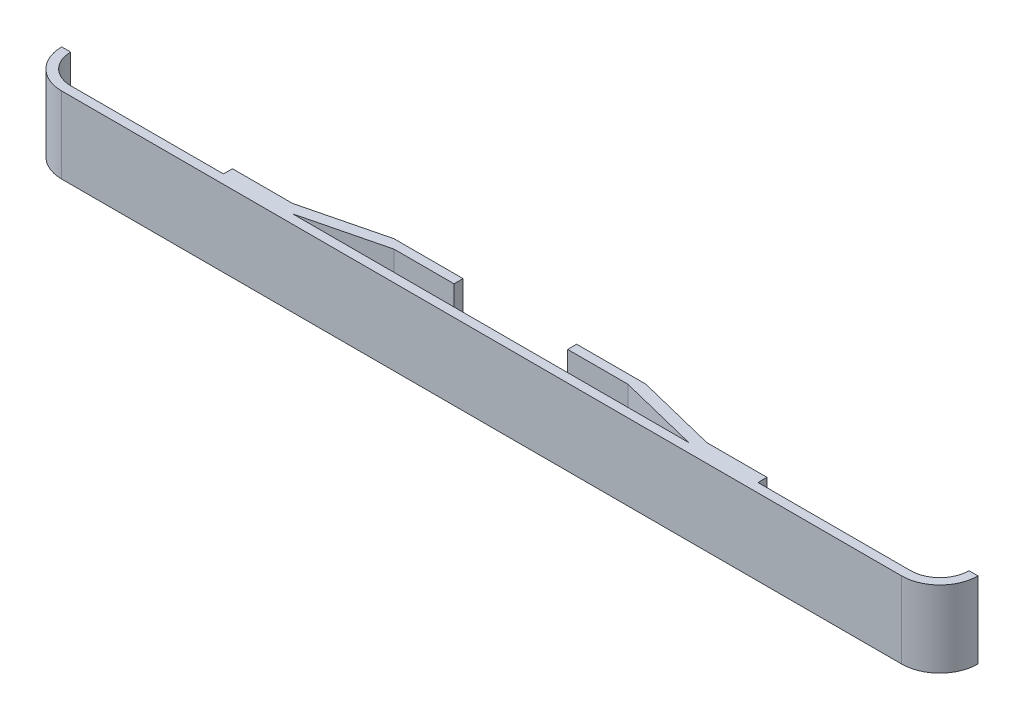
ISO-10303-21;
HEADER;
FILE_DESCRIPTION(('STEP AP214'),'2;1');
FILE_NAME('part.step','',(''),(''),'','','');
FILE_SCHEMA(('AUTOMOTIVE_DESIGN { 1 0 10303 214 1 1 1 1 }'));
ENDSEC;
DATA;
#1=APPLICATION_CONTEXT('core data for automotive mechanical design processes');
#2=APPLICATION_PROTOCOL_DEFINITION('international standard','automotive_design',2000,#1);
#3=PRODUCT_CONTEXT('',#1,'mechanical');
#4=PRODUCT('Part','Part','',(#3));
#5=PRODUCT_RELATED_PRODUCT_CATEGORY('part','',(#4));
#6=PRODUCT_DEFINITION_FORMATION('','',#4);
#7=PRODUCT_DEFINITION_CONTEXT('part definition',#1,'design');
#8=PRODUCT_DEFINITION('design','',#6,#7);
#9=PRODUCT_DEFINITION_SHAPE('','',#8);
#10=(LENGTH_UNIT() NAMED_UNIT(*) SI_UNIT(.MILLI.,.METRE.));
#11=(NAMED_UNIT(*) PLANE_ANGLE_UNIT() SI_UNIT($,.RADIAN.));
#12=(NAMED_UNIT(*) SI_UNIT($,.STERADIAN.) SOLID_ANGLE_UNIT());
#13=UNCERTAINTY_MEASURE_WITH_UNIT(LENGTH_MEASURE(1.E-05),#10,'distance_accuracy_value','');
#14=(GEOMETRIC_REPRESENTATION_CONTEXT(3) GLOBAL_UNCERTAINTY_ASSIGNED_CONTEXT((#13)) GLOBAL_UNIT_ASSIGNED_CONTEXT((#10,
#11,#12)) REPRESENTATION_CONTEXT('',''));
#15=CARTESIAN_POINT('',(0.,0.,0.));
#16=DIRECTION('',(0.,0.,1.));
#17=DIRECTION('',(1.,0.,0.));
#18=AXIS2_PLACEMENT_3D('',#15,#16,#17);
#19=CARTESIAN_POINT('',(-13.3330218068536,-14.8364485981308,9.7));
#20=DIRECTION('',(0.,0.,1.));
#21=DIRECTION('',(1.,0.,0.));
#22=AXIS2_PLACEMENT_3D('',#19,#20,#21);
#23=PLANE('',#22);
#24=DIRECTION('',(0.,1.,0.));
#25=VECTOR('',#24,1.);
#26=CARTESIAN_POINT('',(37.4669781931464,10.5635514018692,9.7));
#27=LINE('',#26,#25);
#28=CARTESIAN_POINT('',(37.4669781931464,-14.8364485981308,9.7));
#29=VERTEX_POINT('',#28);
#30=CARTESIAN_POINT('',(37.4669781931464,10.5635514018692,9.7));
#31=VERTEX_POINT('',#30);
#32=EDGE_CURVE('E229',#29,#31,#27,.T.);
#33=ORIENTED_EDGE('',*,*,#32,.F.);
#34=DIRECTION('',(1.,0.,0.));
#35=VECTOR('',#34,1.);
#36=CARTESIAN_POINT('',(-13.3330218068536,-14.8364485981308,9.7));
#37=LINE('',#36,#35);
#38=CARTESIAN_POINT('',(-13.3330218068536,-14.8364485981308,9.7));
#39=VERTEX_POINT('',#38);
#40=EDGE_CURVE('E218',#39,#29,#37,.T.);
#41=ORIENTED_EDGE('',*,*,#40,.F.);
#42=DIRECTION('',(0.,1.,0.));
#43=VECTOR('',#42,1.);
#44=CARTESIAN_POINT('',(-13.3330218068536,-14.8364485981308,9.7));
#45=LINE('',#44,#43);
#46=CARTESIAN_POINT('',(-13.3330218068536,10.5635514018692,9.7));
#47=VERTEX_POINT('',#46);
#48=EDGE_CURVE('E278',#39,#47,#45,.T.);
#49=ORIENTED_EDGE('',*,*,#48,.T.);
#50=DIRECTION('',(1.,0.,0.));
#51=VECTOR('',#50,1.);
#52=CARTESIAN_POINT('',(-13.3330218068536,10.5635514018692,9.7));
#53=LINE('',#52,#51);
#54=EDGE_CURVE('E260',#47,#31,#53,.T.);
#55=ORIENTED_EDGE('',*,*,#54,.T.);
#56=EDGE_LOOP('',(#33,#41,#49,#55));
#57=FACE_BOUND('',#56,.T.);
#58=ADVANCED_FACE('F34',(#57),#23,.F.);
#59=CARTESIAN_POINT('',(60.4669781931464,-14.8364485981308,9.7));
#60=VERTEX_POINT('',#59);
#61=CARTESIAN_POINT('',(192.266978193146,-14.8364485981308,9.7));
#62=VERTEX_POINT('',#61);
#63=EDGE_CURVE('E265',#60,#62,#37,.T.);
#64=ORIENTED_EDGE('',*,*,#63,.F.);
#65=DIRECTION('',(0.,1.,0.));
#66=VECTOR('',#65,1.);
#67=CARTESIAN_POINT('',(60.4669781931464,-14.8364485981308,9.7));
#68=LINE('',#67,#66);
#69=CARTESIAN_POINT('',(60.4669781931464,10.5635514018692,9.7));
#70=VERTEX_POINT('',#69);
#71=EDGE_CURVE('E346',#60,#70,#68,.T.);
#72=ORIENTED_EDGE('',*,*,#71,.T.);
#73=CARTESIAN_POINT('',(192.266978193146,10.5635514018692,9.7));
#74=VERTEX_POINT('',#73);
#75=EDGE_CURVE('E273',#70,#74,#53,.T.);
#76=ORIENTED_EDGE('',*,*,#75,.T.);
#77=DIRECTION('',(0.,1.,0.));
#78=VECTOR('',#77,1.);
#79=CARTESIAN_POINT('',(192.266978193146,-14.8364485981308,9.7));
#80=LINE('',#79,#78);
#81=EDGE_CURVE('E343',#62,#74,#80,.T.);
#82=ORIENTED_EDGE('',*,*,#81,.F.);
#83=EDGE_LOOP('',(#64,#72,#76,#82));
#84=FACE_BOUND('',#83,.T.);
#85=ADVANCED_FACE('F342',(#84),#23,.F.);
#86=DIRECTION('',(0.,-1.,0.));
#87=VECTOR('',#86,1.);
#88=CARTESIAN_POINT('',(215.266978193146,10.5635514018692,9.7));
#89=LINE('',#88,#87);
#90=CARTESIAN_POINT('',(215.266978193146,10.5635514018692,9.7));
#91=VERTEX_POINT('',#90);
#92=CARTESIAN_POINT('',(215.266978193146,-14.8364485981308,9.7));
#93=VERTEX_POINT('',#92);
#94=EDGE_CURVE('E234',#91,#93,#89,.T.);
#95=ORIENTED_EDGE('',*,*,#94,.F.);
#96=CARTESIAN_POINT('',(266.066978193146,10.5635514018692,9.69999999999999));
#97=VERTEX_POINT('',#96);
#98=EDGE_CURVE('E270',#91,#97,#53,.T.);
#99=ORIENTED_EDGE('',*,*,#98,.T.);
#100=DIRECTION('',(0.,1.,0.));
#101=VECTOR('',#100,1.);
#102=CARTESIAN_POINT('',(266.066978193146,-14.8364485981308,9.69999999999999));
#103=LINE('',#102,#101);
#104=CARTESIAN_POINT('',(266.066978193146,-14.8364485981308,9.69999999999999));
#105=VERTEX_POINT('',#104);
#106=EDGE_CURVE('E274',#105,#97,#103,.T.);
#107=ORIENTED_EDGE('',*,*,#106,.F.);
#108=EDGE_CURVE('E262',#93,#105,#37,.T.);
#109=ORIENTED_EDGE('',*,*,#108,.F.);
#110=EDGE_LOOP('',(#95,#99,#107,#109));
#111=FACE_BOUND('',#110,.T.);
#112=ADVANCED_FACE('F334',(#111),#23,.F.);
#113=CARTESIAN_POINT('',(0.,0.,0.));
#114=DIRECTION('',(0.,0.,1.));
#115=DIRECTION('',(1.,0.,0.));
#116=AXIS2_PLACEMENT_3D('',#113,#114,#115);
#117=PLANE('',#116);
#118=DIRECTION('',(1.,0.,0.));
#119=VECTOR('',#118,1.);
#120=CARTESIAN_POINT('',(-26.0330218068536,-14.8364485981308,0.));
#121=LINE('',#120,#119);
#122=CARTESIAN_POINT('',(275.766978193146,-14.8364485981308,0.));
#123=VERTEX_POINT('',#122);
#124=CARTESIAN_POINT('',(278.766978193146,-14.8364485981308,0.));
#125=VERTEX_POINT('',#124);
#126=EDGE_CURVE('E294',#123,#125,#121,.T.);
#127=ORIENTED_EDGE('',*,*,#126,.F.);
#128=DIRECTION('',(0.,1.,0.));
#129=VECTOR('',#128,1.);
#130=CARTESIAN_POINT('',(275.766978193146,-14.8364485981308,0.));
#131=LINE('',#130,#129);
#132=CARTESIAN_POINT('',(275.766978193146,10.5635514018692,0.));
#133=VERTEX_POINT('',#132);
#134=EDGE_CURVE('E264',#123,#133,#131,.T.);
#135=ORIENTED_EDGE('',*,*,#134,.T.);
#136=DIRECTION('',(1.,0.,0.));
#137=VECTOR('',#136,1.);
#138=CARTESIAN_POINT('',(-26.0330218068536,10.5635514018692,0.));
#139=LINE('',#138,#137);
#140=CARTESIAN_POINT('',(278.766978193146,10.5635514018692,0.));
#141=VERTEX_POINT('',#140);
#142=EDGE_CURVE('E301',#133,#141,#139,.T.);
#143=ORIENTED_EDGE('',*,*,#142,.T.);
#144=DIRECTION('',(0.,-1.,0.));
#145=VECTOR('',#144,1.);
#146=CARTESIAN_POINT('',(278.766978193146,10.5635514018692,0.));
#147=LINE('',#146,#145);
#148=EDGE_CURVE('E298',#141,#125,#147,.T.);
#149=ORIENTED_EDGE('',*,*,#148,.T.);
#150=EDGE_LOOP('',(#127,#135,#143,#149));
#151=FACE_BOUND('',#150,.T.);
#152=ADVANCED_FACE('F324',(#151),#117,.F.);
#153=CARTESIAN_POINT('',(-26.0330218068536,-14.8364485981308,12.7));
#154=DIRECTION('',(0.,1.,0.));
#155=DIRECTION('',(-1.,0.,0.));
#156=AXIS2_PLACEMENT_3D('',#153,#154,#155);
#157=PLANE('',#156);
#158=DIRECTION('',(1.,0.,0.));
#159=VECTOR('',#158,1.);
#160=CARTESIAN_POINT('',(37.4669781931464,-14.8364485981308,6.7));
#161=LINE('',#160,#159);
#162=CARTESIAN_POINT('',(37.4669781931464,-14.8364485981308,6.7));
#163=VERTEX_POINT('',#162);
#164=CARTESIAN_POINT('',(57.4669781931464,-14.8364485981308,6.7));
#165=VERTEX_POINT('',#164);
#166=EDGE_CURVE('E193',#163,#165,#161,.T.);
#167=ORIENTED_EDGE('',*,*,#166,.T.);
#168=DIRECTION('',(0.970563929002576,0.,-0.24084364164138));
#169=VECTOR('',#168,1.);
#170=CARTESIAN_POINT('',(57.4669781931464,-14.8364485981308,6.7));
#171=LINE('',#170,#169);
#172=CARTESIAN_POINT('',(84.4669781931464,-14.8364485981308,0.));
#173=VERTEX_POINT('',#172);
#174=EDGE_CURVE('E204',#165,#173,#171,.T.);
#175=ORIENTED_EDGE('',*,*,#174,.T.);
#176=DIRECTION('',(-1.,0.,0.));
#177=VECTOR('',#176,1.);
#178=CARTESIAN_POINT('',(37.4669781931464,-14.8364485981308,0.));
#179=LINE('',#178,#177);
#180=CARTESIAN_POINT('',(107.466978193146,-14.8364485981308,0.));
#181=VERTEX_POINT('',#180);
#182=EDGE_CURVE('E220',#181,#173,#179,.T.);
#183=ORIENTED_EDGE('',*,*,#182,.F.);
#184=DIRECTION('',(0.,0.,1.));
#185=VECTOR('',#184,1.);
#186=CARTESIAN_POINT('',(107.466978193146,-14.8364485981308,0.));
#187=LINE('',#186,#185);
#188=CARTESIAN_POINT('',(107.466978193146,-14.8364485981308,3.));
#189=VERTEX_POINT('',#188);
#190=EDGE_CURVE('E219',#181,#189,#187,.T.);
#191=ORIENTED_EDGE('',*,*,#190,.T.);
#192=DIRECTION('',(-1.,0.,0.));
#193=VECTOR('',#192,1.);
#194=CARTESIAN_POINT('',(107.466978193146,-14.8364485981308,3.));
#195=LINE('',#194,#193);
#196=CARTESIAN_POINT('',(87.4669781931464,-14.8364485981308,3.));
#197=VERTEX_POINT('',#196);
#198=EDGE_CURVE('E49',#189,#197,#195,.T.);
#199=ORIENTED_EDGE('',*,*,#198,.T.);
#200=DIRECTION('',(-0.970563929002577,0.,0.24084364164138));
#201=VECTOR('',#200,1.);
#202=CARTESIAN_POINT('',(87.4669781931464,-14.8364485981308,3.));
#203=LINE('',#202,#201);
#204=EDGE_CURVE('E396',#197,#60,#203,.T.);
#205=ORIENTED_EDGE('',*,*,#204,.T.);
#206=ORIENTED_EDGE('',*,*,#63,.T.);
#207=DIRECTION('',(-0.970563929002576,0.,-0.24084364164138));
#208=VECTOR('',#207,1.);
#209=CARTESIAN_POINT('',(192.266978193146,-14.8364485981308,9.7));
#210=LINE('',#209,#208);
#211=CARTESIAN_POINT('',(165.266978193146,-14.8364485981308,3.));
#212=VERTEX_POINT('',#211);
#213=EDGE_CURVE('E356',#62,#212,#210,.T.);
#214=ORIENTED_EDGE('',*,*,#213,.T.);
#215=DIRECTION('',(-1.,0.,0.));
#216=VECTOR('',#215,1.);
#217=CARTESIAN_POINT('',(165.266978193146,-14.8364485981308,3.));
#218=LINE('',#217,#216);
#219=CARTESIAN_POINT('',(145.266978193146,-14.8364485981308,3.));
#220=VERTEX_POINT('',#219);
#221=EDGE_CURVE('E358',#212,#220,#218,.T.);
#222=ORIENTED_EDGE('',*,*,#221,.T.);
#223=DIRECTION('',(0.,0.,1.));
#224=VECTOR('',#223,1.);
#225=CARTESIAN_POINT('',(145.266978193146,-14.8364485981308,0.));
#226=LINE('',#225,#224);
#227=CARTESIAN_POINT('',(145.266978193146,-14.8364485981308,0.));
#228=VERTEX_POINT('',#227);
#229=EDGE_CURVE('E243',#228,#220,#226,.T.);
#230=ORIENTED_EDGE('',*,*,#229,.F.);
#231=DIRECTION('',(-1.,0.,0.));
#232=VECTOR('',#231,1.);
#233=CARTESIAN_POINT('',(145.266978193146,-14.8364485981308,0.));
#234=LINE('',#233,#232);
#235=CARTESIAN_POINT('',(168.266978193146,-14.8364485981308,0.));
#236=VERTEX_POINT('',#235);
#237=EDGE_CURVE('E241',#236,#228,#234,.T.);
#238=ORIENTED_EDGE('',*,*,#237,.F.);
#239=DIRECTION('',(0.970563929002576,0.,0.24084364164138));
#240=VECTOR('',#239,1.);
#241=CARTESIAN_POINT('',(195.266978193146,-14.8364485981308,6.7));
#242=LINE('',#241,#240);
#243=CARTESIAN_POINT('',(195.266978193146,-14.8364485981308,6.7));
#244=VERTEX_POINT('',#243);
#245=EDGE_CURVE('E408',#236,#244,#242,.T.);
#246=ORIENTED_EDGE('',*,*,#245,.T.);
#247=DIRECTION('',(1.,0.,0.));
#248=VECTOR('',#247,1.);
#249=CARTESIAN_POINT('',(215.266978193146,-14.8364485981308,6.69999999999999));
#250=LINE('',#249,#248);
#251=CARTESIAN_POINT('',(215.266978193146,-14.8364485981308,6.69999999999999));
#252=VERTEX_POINT('',#251);
#253=EDGE_CURVE('E411',#244,#252,#250,.T.);
#254=ORIENTED_EDGE('',*,*,#253,.T.);
#255=DIRECTION('',(0.,0.,1.));
#256=VECTOR('',#255,1.);
#257=CARTESIAN_POINT('',(215.266978193146,-14.8364485981308,0.));
#258=LINE('',#257,#256);
#259=EDGE_CURVE('E248',#252,#93,#258,.T.);
#260=ORIENTED_EDGE('',*,*,#259,.T.);
#261=ORIENTED_EDGE('',*,*,#108,.T.);
#262=CARTESIAN_POINT('',(266.066978193146,-14.8364485981308,0.));
#263=DIRECTION('',(0.,1.,0.));
#264=DIRECTION('',(0.,0.,1.));
#265=AXIS2_PLACEMENT_3D('',#262,#263,#264);
#266=CIRCLE('',#265,9.69999999999999);
#267=EDGE_CURVE('E256',#105,#123,#266,.T.);
#268=ORIENTED_EDGE('',*,*,#267,.T.);
#269=ORIENTED_EDGE('',*,*,#126,.T.);
#270=CARTESIAN_POINT('',(266.066978193146,-14.8364485981308,0.));
#271=DIRECTION('',(0.,1.,0.));
#272=DIRECTION('',(-1.,0.,0.));
#273=AXIS2_PLACEMENT_3D('',#270,#271,#272);
#274=CIRCLE('',#273,12.7);
#275=CARTESIAN_POINT('',(266.066978193146,-14.8364485981308,12.7));
#276=VERTEX_POINT('',#275);
#277=EDGE_CURVE('E308',#125,#276,#274,.F.);
#278=ORIENTED_EDGE('',*,*,#277,.T.);
#279=DIRECTION('',(1.,0.,0.));
#280=VECTOR('',#279,1.);
#281=CARTESIAN_POINT('',(-26.0330218068536,-14.8364485981308,12.7));
#282=LINE('',#281,#280);
#283=CARTESIAN_POINT('',(-13.3330218068536,-14.8364485981308,12.7));
#284=VERTEX_POINT('',#283);
#285=EDGE_CURVE('E284',#284,#276,#282,.T.);
#286=ORIENTED_EDGE('',*,*,#285,.F.);
#287=CARTESIAN_POINT('',(-13.3330218068536,-14.8364485981308,0.));
#288=DIRECTION('',(0.,1.,0.));
#289=DIRECTION('',(-1.,0.,0.));
#290=AXIS2_PLACEMENT_3D('',#287,#288,#289);
#291=CIRCLE('',#290,12.7);
#292=CARTESIAN_POINT('',(-26.0330218068536,-14.8364485981308,0.));
#293=VERTEX_POINT('',#292);
#294=EDGE_CURVE('E310',#284,#293,#291,.F.);
#295=ORIENTED_EDGE('',*,*,#294,.T.);
#296=CARTESIAN_POINT('',(-23.0330218068536,-14.8364485981308,0.));
#297=VERTEX_POINT('',#296);
#298=EDGE_CURVE('E295',#293,#297,#121,.T.);
#299=ORIENTED_EDGE('',*,*,#298,.T.);
#300=CARTESIAN_POINT('',(-13.3330218068536,-14.8364485981308,0.));
#301=DIRECTION('',(0.,1.,0.));
#302=DIRECTION('',(0.,0.,1.));
#303=AXIS2_PLACEMENT_3D('',#300,#301,#302);
#304=CIRCLE('',#303,9.7);
#305=EDGE_CURVE('E259',#297,#39,#304,.T.);
#306=ORIENTED_EDGE('',*,*,#305,.T.);
#307=ORIENTED_EDGE('',*,*,#40,.T.);
#308=DIRECTION('',(0.,0.,1.));
#309=VECTOR('',#308,1.);
#310=CARTESIAN_POINT('',(37.4669781931464,-14.8364485981308,0.));
#311=LINE('',#310,#309);
#312=EDGE_CURVE('E210',#163,#29,#311,.T.);
#313=ORIENTED_EDGE('',*,*,#312,.F.);
#314=EDGE_LOOP('',(#167,#175,#183,#191,#199,#205,#206,#214,#222,#230,#238,#246,#254,#260,#261,
#268,#269,#278,#286,#295,#299,#306,#307,#313));
#315=FACE_BOUND('',#314,.T.);
#316=ADVANCED_FACE('F215',(#315),#157,.F.);
#317=CARTESIAN_POINT('',(-26.0330218068536,10.5635514018692,12.7));
#318=DIRECTION('',(0.,1.,0.));
#319=DIRECTION('',(0.,0.,1.));
#320=AXIS2_PLACEMENT_3D('',#317,#318,#319);
#321=PLANE('',#320);
#322=DIRECTION('',(0.970563929002576,0.,-0.24084364164138));
#323=VECTOR('',#322,1.);
#324=CARTESIAN_POINT('',(57.4669781931464,10.5635514018692,6.7));
#325=LINE('',#324,#323);
#326=CARTESIAN_POINT('',(57.4669781931464,10.5635514018692,6.7));
#327=VERTEX_POINT('',#326);
#328=CARTESIAN_POINT('',(84.4669781931464,10.5635514018692,0.));
#329=VERTEX_POINT('',#328);
#330=EDGE_CURVE('E57',#327,#329,#325,.T.);
#331=ORIENTED_EDGE('',*,*,#330,.F.);
#332=DIRECTION('',(1.,0.,0.));
#333=VECTOR('',#332,1.);
#334=CARTESIAN_POINT('',(37.4669781931464,10.5635514018692,6.7));
#335=LINE('',#334,#333);
#336=CARTESIAN_POINT('',(37.4669781931464,10.5635514018692,6.7));
#337=VERTEX_POINT('',#336);
#338=EDGE_CURVE('E388',#337,#327,#335,.T.);
#339=ORIENTED_EDGE('',*,*,#338,.F.);
#340=DIRECTION('',(0.,0.,1.));
#341=VECTOR('',#340,1.);
#342=CARTESIAN_POINT('',(37.4669781931464,10.5635514018692,0.));
#343=LINE('',#342,#341);
#344=EDGE_CURVE('E212',#337,#31,#343,.T.);
#345=ORIENTED_EDGE('',*,*,#344,.T.);
#346=ORIENTED_EDGE('',*,*,#54,.F.);
#347=CARTESIAN_POINT('',(-13.3330218068536,10.5635514018692,0.));
#348=DIRECTION('',(0.,1.,0.));
#349=DIRECTION('',(0.,0.,1.));
#350=AXIS2_PLACEMENT_3D('',#347,#348,#349);
#351=CIRCLE('',#350,9.7);
#352=CARTESIAN_POINT('',(-23.0330218068536,10.5635514018692,0.));
#353=VERTEX_POINT('',#352);
#354=EDGE_CURVE('E267',#353,#47,#351,.T.);
#355=ORIENTED_EDGE('',*,*,#354,.F.);
#356=CARTESIAN_POINT('',(-26.0330218068536,10.5635514018692,0.));
#357=VERTEX_POINT('',#356);
#358=EDGE_CURVE('E288',#357,#353,#139,.T.);
#359=ORIENTED_EDGE('',*,*,#358,.F.);
#360=CARTESIAN_POINT('',(-13.3330218068536,10.5635514018692,0.));
#361=DIRECTION('',(0.,1.,0.));
#362=DIRECTION('',(0.,0.,1.));
#363=AXIS2_PLACEMENT_3D('',#360,#361,#362);
#364=CIRCLE('',#363,12.7);
#365=CARTESIAN_POINT('',(-13.3330218068536,10.5635514018692,12.7));
#366=VERTEX_POINT('',#365);
#367=EDGE_CURVE('E11',#357,#366,#364,.T.);
#368=ORIENTED_EDGE('',*,*,#367,.T.);
#369=DIRECTION('',(1.,0.,0.));
#370=VECTOR('',#369,1.);
#371=CARTESIAN_POINT('',(-26.0330218068536,10.5635514018692,12.7));
#372=LINE('',#371,#370);
#373=CARTESIAN_POINT('',(266.066978193146,10.5635514018692,12.7));
#374=VERTEX_POINT('',#373);
#375=EDGE_CURVE('E287',#366,#374,#372,.T.);
#376=ORIENTED_EDGE('',*,*,#375,.T.);
#377=CARTESIAN_POINT('',(266.066978193146,10.5635514018692,0.));
#378=DIRECTION('',(0.,1.,0.));
#379=DIRECTION('',(0.,0.,1.));
#380=AXIS2_PLACEMENT_3D('',#377,#378,#379);
#381=CIRCLE('',#380,12.7);
#382=EDGE_CURVE('E42',#374,#141,#381,.T.);
#383=ORIENTED_EDGE('',*,*,#382,.T.);
#384=ORIENTED_EDGE('',*,*,#142,.F.);
#385=CARTESIAN_POINT('',(266.066978193146,10.5635514018692,0.));
#386=DIRECTION('',(0.,1.,0.));
#387=DIRECTION('',(0.,0.,1.));
#388=AXIS2_PLACEMENT_3D('',#385,#386,#387);
#389=CIRCLE('',#388,9.69999999999999);
#390=EDGE_CURVE('E255',#97,#133,#389,.T.);
#391=ORIENTED_EDGE('',*,*,#390,.F.);
#392=ORIENTED_EDGE('',*,*,#98,.F.);
#393=DIRECTION('',(0.,0.,1.));
#394=VECTOR('',#393,1.);
#395=CARTESIAN_POINT('',(215.266978193146,10.5635514018692,0.));
#396=LINE('',#395,#394);
#397=CARTESIAN_POINT('',(215.266978193146,10.5635514018692,6.69999999999999));
#398=VERTEX_POINT('',#397);
#399=EDGE_CURVE('E250',#398,#91,#396,.T.);
#400=ORIENTED_EDGE('',*,*,#399,.F.);
#401=DIRECTION('',(1.,0.,0.));
#402=VECTOR('',#401,1.);
#403=CARTESIAN_POINT('',(215.266978193146,10.5635514018692,6.69999999999999));
#404=LINE('',#403,#402);
#405=CARTESIAN_POINT('',(195.266978193146,10.5635514018692,6.7));
#406=VERTEX_POINT('',#405);
#407=EDGE_CURVE('E412',#406,#398,#404,.T.);
#408=ORIENTED_EDGE('',*,*,#407,.F.);
#409=DIRECTION('',(0.970563929002576,0.,0.24084364164138));
#410=VECTOR('',#409,1.);
#411=CARTESIAN_POINT('',(195.266978193146,10.5635514018692,6.7));
#412=LINE('',#411,#410);
#413=CARTESIAN_POINT('',(168.266978193146,10.5635514018692,0.));
#414=VERTEX_POINT('',#413);
#415=EDGE_CURVE('E404',#414,#406,#412,.T.);
#416=ORIENTED_EDGE('',*,*,#415,.F.);
#417=DIRECTION('',(1.,0.,0.));
#418=VECTOR('',#417,1.);
#419=CARTESIAN_POINT('',(145.266978193146,10.5635514018692,0.));
#420=LINE('',#419,#418);
#421=CARTESIAN_POINT('',(145.266978193146,10.5635514018692,0.));
#422=VERTEX_POINT('',#421);
#423=EDGE_CURVE('E238',#422,#414,#420,.T.);
#424=ORIENTED_EDGE('',*,*,#423,.F.);
#425=DIRECTION('',(0.,0.,1.));
#426=VECTOR('',#425,1.);
#427=CARTESIAN_POINT('',(145.266978193146,10.5635514018692,0.));
#428=LINE('',#427,#426);
#429=CARTESIAN_POINT('',(145.266978193146,10.5635514018692,3.));
#430=VERTEX_POINT('',#429);
#431=EDGE_CURVE('E252',#422,#430,#428,.T.);
#432=ORIENTED_EDGE('',*,*,#431,.T.);
#433=DIRECTION('',(-1.,0.,0.));
#434=VECTOR('',#433,1.);
#435=CARTESIAN_POINT('',(165.266978193146,10.5635514018692,3.));
#436=LINE('',#435,#434);
#437=CARTESIAN_POINT('',(165.266978193146,10.5635514018692,3.));
#438=VERTEX_POINT('',#437);
#439=EDGE_CURVE('E360',#438,#430,#436,.T.);
#440=ORIENTED_EDGE('',*,*,#439,.F.);
#441=DIRECTION('',(-0.970563929002576,0.,-0.24084364164138));
#442=VECTOR('',#441,1.);
#443=CARTESIAN_POINT('',(192.266978193146,10.5635514018692,9.7));
#444=LINE('',#443,#442);
#445=EDGE_CURVE('E353',#74,#438,#444,.T.);
#446=ORIENTED_EDGE('',*,*,#445,.F.);
#447=ORIENTED_EDGE('',*,*,#75,.F.);
#448=DIRECTION('',(-0.970563929002577,0.,0.24084364164138));
#449=VECTOR('',#448,1.);
#450=CARTESIAN_POINT('',(87.4669781931464,10.5635514018692,3.));
#451=LINE('',#450,#449);
#452=CARTESIAN_POINT('',(87.4669781931464,10.5635514018692,3.));
#453=VERTEX_POINT('',#452);
#454=EDGE_CURVE('E397',#453,#70,#451,.T.);
#455=ORIENTED_EDGE('',*,*,#454,.F.);
#456=DIRECTION('',(-1.,0.,0.));
#457=VECTOR('',#456,1.);
#458=CARTESIAN_POINT('',(107.466978193146,10.5635514018692,3.));
#459=LINE('',#458,#457);
#460=CARTESIAN_POINT('',(107.466978193146,10.5635514018692,3.));
#461=VERTEX_POINT('',#460);
#462=EDGE_CURVE('E393',#461,#453,#459,.T.);
#463=ORIENTED_EDGE('',*,*,#462,.F.);
#464=DIRECTION('',(0.,0.,1.));
#465=VECTOR('',#464,1.);
#466=CARTESIAN_POINT('',(107.466978193146,10.5635514018692,0.));
#467=LINE('',#466,#465);
#468=CARTESIAN_POINT('',(107.466978193146,10.5635514018692,0.));
#469=VERTEX_POINT('',#468);
#470=EDGE_CURVE('E223',#469,#461,#467,.T.);
#471=ORIENTED_EDGE('',*,*,#470,.F.);
#472=DIRECTION('',(1.,0.,0.));
#473=VECTOR('',#472,1.);
#474=CARTESIAN_POINT('',(37.4669781931464,10.5635514018692,0.));
#475=LINE('',#474,#473);
#476=EDGE_CURVE('E374',#329,#469,#475,.T.);
#477=ORIENTED_EDGE('',*,*,#476,.F.);
#478=EDGE_LOOP('',(#331,#339,#345,#346,#355,#359,#368,#376,#383,#384,#391,#392,#400,#408,#416,
#424,#432,#440,#446,#447,#455,#463,#471,#477));
#479=FACE_BOUND('',#478,.T.);
#480=ADVANCED_FACE('F316',(#479),#321,.T.);
#481=CARTESIAN_POINT('',(0.,0.,12.7));
#482=DIRECTION('',(0.,0.,1.));
#483=DIRECTION('',(1.,0.,0.));
#484=AXIS2_PLACEMENT_3D('',#481,#482,#483);
#485=PLANE('',#484);
#486=ORIENTED_EDGE('',*,*,#375,.F.);
#487=DIRECTION('',(0.,-1.,0.));
#488=VECTOR('',#487,1.);
#489=CARTESIAN_POINT('',(-13.3330218068536,-14.8364485981308,12.7));
#490=LINE('',#489,#488);
#491=EDGE_CURVE('E305',#366,#284,#490,.T.);
#492=ORIENTED_EDGE('',*,*,#491,.T.);
#493=ORIENTED_EDGE('',*,*,#285,.T.);
#494=DIRECTION('',(0.,-1.,0.));
#495=VECTOR('',#494,1.);
#496=CARTESIAN_POINT('',(266.066978193146,0.,12.7));
#497=LINE('',#496,#495);
#498=EDGE_CURVE('E291',#276,#374,#497,.F.);
#499=ORIENTED_EDGE('',*,*,#498,.T.);
#500=EDGE_LOOP('',(#486,#492,#493,#499));
#501=FACE_BOUND('',#500,.T.);
#502=ADVANCED_FACE('F469',(#501),#485,.T.);
#503=ORIENTED_EDGE('',*,*,#358,.T.);
#504=DIRECTION('',(0.,1.,0.));
#505=VECTOR('',#504,1.);
#506=CARTESIAN_POINT('',(-23.0330218068536,-14.8364485981308,0.));
#507=LINE('',#506,#505);
#508=EDGE_CURVE('E280',#297,#353,#507,.T.);
#509=ORIENTED_EDGE('',*,*,#508,.F.);
#510=ORIENTED_EDGE('',*,*,#298,.F.);
#511=DIRECTION('',(0.,-1.,0.));
#512=VECTOR('',#511,1.);
#513=CARTESIAN_POINT('',(-26.0330218068536,10.5635514018692,0.));
#514=LINE('',#513,#512);
#515=EDGE_CURVE('E277',#357,#293,#514,.T.);
#516=ORIENTED_EDGE('',*,*,#515,.F.);
#517=EDGE_LOOP('',(#503,#509,#510,#516));
#518=FACE_BOUND('',#517,.T.);
#519=ADVANCED_FACE('F460',(#518),#117,.F.);
#520=CARTESIAN_POINT('',(-13.3330218068536,0.,0.));
#521=DIRECTION('',(0.,1.,0.));
#522=DIRECTION('',(0.,0.,1.));
#523=AXIS2_PLACEMENT_3D('',#520,#521,#522);
#524=CYLINDRICAL_SURFACE('',#523,12.7);
#525=ORIENTED_EDGE('',*,*,#367,.F.);
#526=ORIENTED_EDGE('',*,*,#515,.T.);
#527=ORIENTED_EDGE('',*,*,#294,.F.);
#528=ORIENTED_EDGE('',*,*,#491,.F.);
#529=EDGE_LOOP('',(#525,#526,#527,#528));
#530=FACE_BOUND('',#529,.T.);
#531=ADVANCED_FACE('F468',(#530),#524,.T.);
#532=CARTESIAN_POINT('',(266.066978193146,10.5635514018692,0.));
#533=DIRECTION('',(0.,-1.,0.));
#534=DIRECTION('',(0.,0.,-1.));
#535=AXIS2_PLACEMENT_3D('',#532,#533,#534);
#536=CYLINDRICAL_SURFACE('',#535,12.7);
#537=ORIENTED_EDGE('',*,*,#382,.F.);
#538=ORIENTED_EDGE('',*,*,#498,.F.);
#539=ORIENTED_EDGE('',*,*,#277,.F.);
#540=ORIENTED_EDGE('',*,*,#148,.F.);
#541=EDGE_LOOP('',(#537,#538,#539,#540));
#542=FACE_BOUND('',#541,.T.);
#543=ADVANCED_FACE('F36',(#542),#536,.T.);
#544=CARTESIAN_POINT('',(266.066978193146,-14.8364485981308,0.));
#545=DIRECTION('',(0.,1.,0.));
#546=DIRECTION('',(0.,0.,1.));
#547=AXIS2_PLACEMENT_3D('',#544,#545,#546);
#548=CYLINDRICAL_SURFACE('',#547,9.69999999999999);
#549=ORIENTED_EDGE('',*,*,#390,.T.);
#550=ORIENTED_EDGE('',*,*,#134,.F.);
#551=ORIENTED_EDGE('',*,*,#267,.F.);
#552=ORIENTED_EDGE('',*,*,#106,.T.);
#553=EDGE_LOOP('',(#549,#550,#551,#552));
#554=FACE_BOUND('',#553,.T.);
#555=ADVANCED_FACE('F327',(#554),#548,.F.);
#556=CARTESIAN_POINT('',(-13.3330218068536,-14.8364485981308,0.));
#557=DIRECTION('',(0.,1.,0.));
#558=DIRECTION('',(0.,0.,1.));
#559=AXIS2_PLACEMENT_3D('',#556,#557,#558);
#560=CYLINDRICAL_SURFACE('',#559,9.7);
#561=ORIENTED_EDGE('',*,*,#354,.T.);
#562=ORIENTED_EDGE('',*,*,#48,.F.);
#563=ORIENTED_EDGE('',*,*,#305,.F.);
#564=ORIENTED_EDGE('',*,*,#508,.T.);
#565=EDGE_LOOP('',(#561,#562,#563,#564));
#566=FACE_BOUND('',#565,.T.);
#567=ADVANCED_FACE('F446',(#566),#560,.F.);
#568=CARTESIAN_POINT('',(145.266978193146,10.5635514018692,0.));
#569=DIRECTION('',(1.,0.,0.));
#570=DIRECTION('',(0.,0.,-1.));
#571=AXIS2_PLACEMENT_3D('',#568,#569,#570);
#572=PLANE('',#571);
#573=ORIENTED_EDGE('',*,*,#229,.T.);
#574=DIRECTION('',(0.,1.,0.));
#575=VECTOR('',#574,1.);
#576=CARTESIAN_POINT('',(145.266978193146,-14.8364485981308,3.));
#577=LINE('',#576,#575);
#578=EDGE_CURVE('E370',#220,#430,#577,.T.);
#579=ORIENTED_EDGE('',*,*,#578,.T.);
#580=ORIENTED_EDGE('',*,*,#431,.F.);
#581=DIRECTION('',(0.,1.,0.));
#582=VECTOR('',#581,1.);
#583=CARTESIAN_POINT('',(145.266978193146,10.5635514018692,0.));
#584=LINE('',#583,#582);
#585=EDGE_CURVE('E235',#228,#422,#584,.T.);
#586=ORIENTED_EDGE('',*,*,#585,.F.);
#587=EDGE_LOOP('',(#573,#579,#580,#586));
#588=FACE_BOUND('',#587,.T.);
#589=ADVANCED_FACE('F426',(#588),#572,.F.);
#590=CARTESIAN_POINT('',(215.266978193146,10.5635514018692,0.));
#591=DIRECTION('',(-1.,0.,0.));
#592=DIRECTION('',(0.,0.,1.));
#593=AXIS2_PLACEMENT_3D('',#590,#591,#592);
#594=PLANE('',#593);
#595=ORIENTED_EDGE('',*,*,#259,.F.);
#596=DIRECTION('',(0.,1.,0.));
#597=VECTOR('',#596,1.);
#598=CARTESIAN_POINT('',(215.266978193146,-14.8364485981308,6.69999999999999));
#599=LINE('',#598,#597);
#600=EDGE_CURVE('E361',#252,#398,#599,.T.);
#601=ORIENTED_EDGE('',*,*,#600,.T.);
#602=ORIENTED_EDGE('',*,*,#399,.T.);
#603=ORIENTED_EDGE('',*,*,#94,.T.);
#604=EDGE_LOOP('',(#595,#601,#602,#603));
#605=FACE_BOUND('',#604,.T.);
#606=ADVANCED_FACE('F438',(#605),#594,.F.);
#607=CARTESIAN_POINT('',(0.,0.,0.));
#608=DIRECTION('',(0.,0.,1.));
#609=DIRECTION('',(1.,0.,0.));
#610=AXIS2_PLACEMENT_3D('',#607,#608,#609);
#611=PLANE('',#610);
#612=ORIENTED_EDGE('',*,*,#423,.T.);
#613=DIRECTION('',(0.,1.,0.));
#614=VECTOR('',#613,1.);
#615=CARTESIAN_POINT('',(168.266978193146,-14.8364485981308,0.));
#616=LINE('',#615,#614);
#617=EDGE_CURVE('E414',#236,#414,#616,.T.);
#618=ORIENTED_EDGE('',*,*,#617,.F.);
#619=ORIENTED_EDGE('',*,*,#237,.T.);
#620=ORIENTED_EDGE('',*,*,#585,.T.);
#621=EDGE_LOOP('',(#612,#618,#619,#620));
#622=FACE_BOUND('',#621,.T.);
#623=ADVANCED_FACE('F429',(#622),#611,.F.);
#624=CARTESIAN_POINT('',(37.4669781931464,10.5635514018692,0.));
#625=DIRECTION('',(1.,0.,0.));
#626=DIRECTION('',(0.,0.,-1.));
#627=AXIS2_PLACEMENT_3D('',#624,#625,#626);
#628=PLANE('',#627);
#629=ORIENTED_EDGE('',*,*,#344,.F.);
#630=DIRECTION('',(0.,1.,0.));
#631=VECTOR('',#630,1.);
#632=CARTESIAN_POINT('',(37.4669781931464,-14.8364485981308,6.7));
#633=LINE('',#632,#631);
#634=EDGE_CURVE('E197',#163,#337,#633,.T.);
#635=ORIENTED_EDGE('',*,*,#634,.F.);
#636=ORIENTED_EDGE('',*,*,#312,.T.);
#637=ORIENTED_EDGE('',*,*,#32,.T.);
#638=EDGE_LOOP('',(#629,#635,#636,#637));
#639=FACE_BOUND('',#638,.T.);
#640=ADVANCED_FACE('F208',(#639),#628,.F.);
#641=CARTESIAN_POINT('',(107.466978193146,10.5635514018692,0.));
#642=DIRECTION('',(-1.,0.,0.));
#643=DIRECTION('',(0.,0.,1.));
#644=AXIS2_PLACEMENT_3D('',#641,#642,#643);
#645=PLANE('',#644);
#646=ORIENTED_EDGE('',*,*,#470,.T.);
#647=DIRECTION('',(0.,1.,0.));
#648=VECTOR('',#647,1.);
#649=CARTESIAN_POINT('',(107.466978193146,-14.8364485981308,3.));
#650=LINE('',#649,#648);
#651=EDGE_CURVE('E385',#189,#461,#650,.T.);
#652=ORIENTED_EDGE('',*,*,#651,.F.);
#653=ORIENTED_EDGE('',*,*,#190,.F.);
#654=DIRECTION('',(0.,-1.,0.));
#655=VECTOR('',#654,1.);
#656=CARTESIAN_POINT('',(107.466978193146,10.5635514018692,0.));
#657=LINE('',#656,#655);
#658=EDGE_CURVE('E226',#469,#181,#657,.T.);
#659=ORIENTED_EDGE('',*,*,#658,.F.);
#660=EDGE_LOOP('',(#646,#652,#653,#659));
#661=FACE_BOUND('',#660,.T.);
#662=ADVANCED_FACE('F384',(#661),#645,.F.);
#663=CARTESIAN_POINT('',(0.,0.,0.));
#664=DIRECTION('',(0.,0.,1.));
#665=DIRECTION('',(1.,0.,0.));
#666=AXIS2_PLACEMENT_3D('',#663,#664,#665);
#667=PLANE('',#666);
#668=ORIENTED_EDGE('',*,*,#182,.T.);
#669=DIRECTION('',(0.,1.,0.));
#670=VECTOR('',#669,1.);
#671=CARTESIAN_POINT('',(84.4669781931464,-14.8364485981308,0.));
#672=LINE('',#671,#670);
#673=EDGE_CURVE('E391',#173,#329,#672,.T.);
#674=ORIENTED_EDGE('',*,*,#673,.T.);
#675=ORIENTED_EDGE('',*,*,#476,.T.);
#676=ORIENTED_EDGE('',*,*,#658,.T.);
#677=EDGE_LOOP('',(#668,#674,#675,#676));
#678=FACE_BOUND('',#677,.T.);
#679=ADVANCED_FACE('F379',(#678),#667,.F.);
#680=CARTESIAN_POINT('',(215.266978193146,-14.8364485981308,6.69999999999999));
#681=DIRECTION('',(0.,0.,1.));
#682=DIRECTION('',(1.,0.,0.));
#683=AXIS2_PLACEMENT_3D('',#680,#681,#682);
#684=PLANE('',#683);
#685=ORIENTED_EDGE('',*,*,#407,.T.);
#686=ORIENTED_EDGE('',*,*,#600,.F.);
#687=ORIENTED_EDGE('',*,*,#253,.F.);
#688=DIRECTION('',(0.,1.,0.));
#689=VECTOR('',#688,1.);
#690=CARTESIAN_POINT('',(195.266978193146,-14.8364485981308,6.7));
#691=LINE('',#690,#689);
#692=EDGE_CURVE('E365',#244,#406,#691,.T.);
#693=ORIENTED_EDGE('',*,*,#692,.T.);
#694=EDGE_LOOP('',(#685,#686,#687,#693));
#695=FACE_BOUND('',#694,.T.);
#696=ADVANCED_FACE('F436',(#695),#684,.F.);
#697=CARTESIAN_POINT('',(195.266978193146,-14.8364485981308,6.7));
#698=DIRECTION('',(-0.24084364164138,0.,0.970563929002577));
#699=DIRECTION('',(0.970563929002577,0.,0.24084364164138));
#700=AXIS2_PLACEMENT_3D('',#697,#698,#699);
#701=PLANE('',#700);
#702=ORIENTED_EDGE('',*,*,#415,.T.);
#703=ORIENTED_EDGE('',*,*,#692,.F.);
#704=ORIENTED_EDGE('',*,*,#245,.F.);
#705=ORIENTED_EDGE('',*,*,#617,.T.);
#706=EDGE_LOOP('',(#702,#703,#704,#705));
#707=FACE_BOUND('',#706,.T.);
#708=ADVANCED_FACE('F433',(#707),#701,.F.);
#709=CARTESIAN_POINT('',(165.266978193146,-14.8364485981308,3.));
#710=DIRECTION('',(0.,0.,-1.));
#711=DIRECTION('',(-1.,0.,0.));
#712=AXIS2_PLACEMENT_3D('',#709,#710,#711);
#713=PLANE('',#712);
#714=ORIENTED_EDGE('',*,*,#439,.T.);
#715=ORIENTED_EDGE('',*,*,#578,.F.);
#716=ORIENTED_EDGE('',*,*,#221,.F.);
#717=DIRECTION('',(0.,1.,0.));
#718=VECTOR('',#717,1.);
#719=CARTESIAN_POINT('',(165.266978193146,-14.8364485981308,3.));
#720=LINE('',#719,#718);
#721=EDGE_CURVE('E357',#212,#438,#720,.T.);
#722=ORIENTED_EDGE('',*,*,#721,.T.);
#723=EDGE_LOOP('',(#714,#715,#716,#722));
#724=FACE_BOUND('',#723,.T.);
#725=ADVANCED_FACE('F506',(#724),#713,.F.);
#726=CARTESIAN_POINT('',(192.266978193146,-14.8364485981308,9.7));
#727=DIRECTION('',(0.24084364164138,0.,-0.970563929002577));
#728=DIRECTION('',(-0.970563929002577,0.,-0.24084364164138));
#729=AXIS2_PLACEMENT_3D('',#726,#727,#728);
#730=PLANE('',#729);
#731=ORIENTED_EDGE('',*,*,#445,.T.);
#732=ORIENTED_EDGE('',*,*,#721,.F.);
#733=ORIENTED_EDGE('',*,*,#213,.F.);
#734=ORIENTED_EDGE('',*,*,#81,.T.);
#735=EDGE_LOOP('',(#731,#732,#733,#734));
#736=FACE_BOUND('',#735,.T.);
#737=ADVANCED_FACE('F352',(#736),#730,.F.);
#738=CARTESIAN_POINT('',(57.4669781931464,-14.8364485981308,6.7));
#739=DIRECTION('',(0.24084364164138,0.,0.970563929002577));
#740=DIRECTION('',(0.970563929002577,0.,-0.24084364164138));
#741=AXIS2_PLACEMENT_3D('',#738,#739,#740);
#742=PLANE('',#741);
#743=ORIENTED_EDGE('',*,*,#330,.T.);
#744=ORIENTED_EDGE('',*,*,#673,.F.);
#745=ORIENTED_EDGE('',*,*,#174,.F.);
#746=DIRECTION('',(0.,1.,0.));
#747=VECTOR('',#746,1.);
#748=CARTESIAN_POINT('',(57.4669781931464,-14.8364485981308,6.7));
#749=LINE('',#748,#747);
#750=EDGE_CURVE('E199',#165,#327,#749,.T.);
#751=ORIENTED_EDGE('',*,*,#750,.T.);
#752=EDGE_LOOP('',(#743,#744,#745,#751));
#753=FACE_BOUND('',#752,.T.);
#754=ADVANCED_FACE('F498',(#753),#742,.F.);
#755=CARTESIAN_POINT('',(37.4669781931464,-14.8364485981308,6.7));
#756=DIRECTION('',(0.,0.,1.));
#757=DIRECTION('',(1.,0.,0.));
#758=AXIS2_PLACEMENT_3D('',#755,#756,#757);
#759=PLANE('',#758);
#760=ORIENTED_EDGE('',*,*,#338,.T.);
#761=ORIENTED_EDGE('',*,*,#750,.F.);
#762=ORIENTED_EDGE('',*,*,#166,.F.);
#763=ORIENTED_EDGE('',*,*,#634,.T.);
#764=EDGE_LOOP('',(#760,#761,#762,#763));
#765=FACE_BOUND('',#764,.T.);
#766=ADVANCED_FACE('F196',(#765),#759,.F.);
#767=CARTESIAN_POINT('',(87.4669781931464,-14.8364485981308,3.));
#768=DIRECTION('',(-0.24084364164138,0.,-0.970563929002577));
#769=DIRECTION('',(-0.970563929002577,0.,0.24084364164138));
#770=AXIS2_PLACEMENT_3D('',#767,#768,#769);
#771=PLANE('',#770);
#772=ORIENTED_EDGE('',*,*,#454,.T.);
#773=ORIENTED_EDGE('',*,*,#71,.F.);
#774=ORIENTED_EDGE('',*,*,#204,.F.);
#775=DIRECTION('',(0.,1.,0.));
#776=VECTOR('',#775,1.);
#777=CARTESIAN_POINT('',(87.4669781931464,-14.8364485981308,3.));
#778=LINE('',#777,#776);
#779=EDGE_CURVE('E405',#197,#453,#778,.T.);
#780=ORIENTED_EDGE('',*,*,#779,.T.);
#781=EDGE_LOOP('',(#772,#773,#774,#780));
#782=FACE_BOUND('',#781,.T.);
#783=ADVANCED_FACE('F490',(#782),#771,.F.);
#784=CARTESIAN_POINT('',(107.466978193146,-14.8364485981308,3.));
#785=DIRECTION('',(0.,0.,-1.));
#786=DIRECTION('',(-1.,0.,0.));
#787=AXIS2_PLACEMENT_3D('',#784,#785,#786);
#788=PLANE('',#787);
#789=ORIENTED_EDGE('',*,*,#462,.T.);
#790=ORIENTED_EDGE('',*,*,#779,.F.);
#791=ORIENTED_EDGE('',*,*,#198,.F.);
#792=ORIENTED_EDGE('',*,*,#651,.T.);
#793=EDGE_LOOP('',(#789,#790,#791,#792));
#794=FACE_BOUND('',#793,.T.);
#795=ADVANCED_FACE('F487',(#794),#788,.F.);
#796=CLOSED_SHELL('',(#58,#85,#112,#152,#316,#480,#502,#519,#531,#543,#555,#567,#589,#606,#623,
#640,#662,#679,#696,#708,#725,#737,#754,#766,#783,#795));
#797=MANIFOLD_SOLID_BREP('B2',#796);
#798=ADVANCED_BREP_SHAPE_REPRESENTATION('',(#18,#797),#14);
#799=SHAPE_DEFINITION_REPRESENTATION(#9,#798);
ENDSEC;
END-ISO-10303-21;
